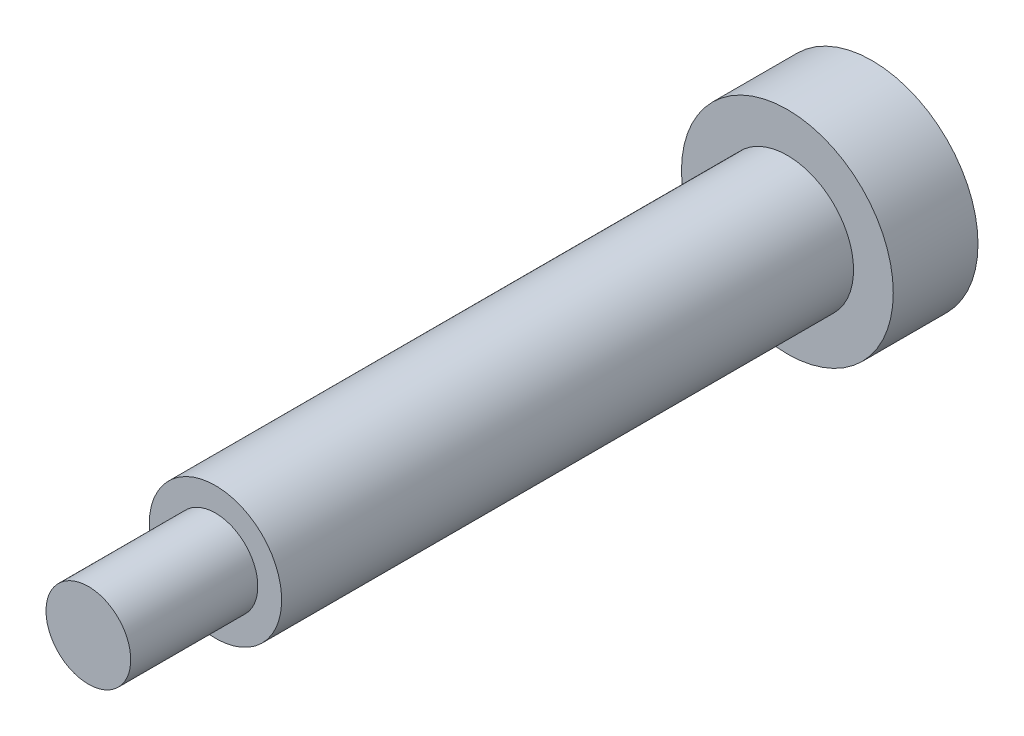
ISO-10303-21;
HEADER;
FILE_DESCRIPTION(('STEP AP214'),'2;1');
FILE_NAME('part.step','',(''),(''),'','','');
FILE_SCHEMA(('AUTOMOTIVE_DESIGN { 1 0 10303 214 1 1 1 1 }'));
ENDSEC;
DATA;
#1=APPLICATION_CONTEXT('core data for automotive mechanical design processes');
#2=APPLICATION_PROTOCOL_DEFINITION('international standard','automotive_design',2000,#1);
#3=PRODUCT_CONTEXT('',#1,'mechanical');
#4=PRODUCT('Part','Part','',(#3));
#5=PRODUCT_RELATED_PRODUCT_CATEGORY('part','',(#4));
#6=PRODUCT_DEFINITION_FORMATION('','',#4);
#7=PRODUCT_DEFINITION_CONTEXT('part definition',#1,'design');
#8=PRODUCT_DEFINITION('design','',#6,#7);
#9=PRODUCT_DEFINITION_SHAPE('','',#8);
#10=(LENGTH_UNIT() NAMED_UNIT(*) SI_UNIT(.MILLI.,.METRE.));
#11=(NAMED_UNIT(*) PLANE_ANGLE_UNIT() SI_UNIT($,.RADIAN.));
#12=(NAMED_UNIT(*) SI_UNIT($,.STERADIAN.) SOLID_ANGLE_UNIT());
#13=UNCERTAINTY_MEASURE_WITH_UNIT(LENGTH_MEASURE(1.E-05),#10,'distance_accuracy_value','');
#14=(GEOMETRIC_REPRESENTATION_CONTEXT(3) GLOBAL_UNCERTAINTY_ASSIGNED_CONTEXT((#13)) GLOBAL_UNIT_ASSIGNED_CONTEXT((#10,
#11,#12)) REPRESENTATION_CONTEXT('',''));
#15=CARTESIAN_POINT('',(0.,0.,0.));
#16=DIRECTION('',(0.,0.,1.));
#17=DIRECTION('',(1.,0.,0.));
#18=AXIS2_PLACEMENT_3D('',#15,#16,#17);
#19=CARTESIAN_POINT('',(0.,0.,0.));
#20=DIRECTION('',(0.,0.,-1.));
#21=DIRECTION('',(-1.,0.,0.));
#22=AXIS2_PLACEMENT_3D('',#19,#20,#21);
#23=PLANE('',#22);
#24=CARTESIAN_POINT('',(0.,0.,0.));
#25=DIRECTION('',(0.,0.,-1.));
#26=DIRECTION('',(-1.,0.,0.));
#27=AXIS2_PLACEMENT_3D('',#24,#25,#26);
#28=CIRCLE('',#27,2.);
#29=CARTESIAN_POINT('',(-2.,0.,0.));
#30=VERTEX_POINT('',#29);
#31=EDGE_CURVE('E10',#30,#30,#28,.T.);
#32=ORIENTED_EDGE('',*,*,#31,.F.);
#33=EDGE_LOOP('',(#32));
#34=FACE_BOUND('',#33,.T.);
#35=ADVANCED_FACE('F39',(#34),#23,.F.);
#36=CARTESIAN_POINT('',(0.,0.,-34.6363636363637));
#37=DIRECTION('',(0.,0.,-1.));
#38=DIRECTION('',(-1.,0.,0.));
#39=AXIS2_PLACEMENT_3D('',#36,#37,#38);
#40=CYLINDRICAL_SURFACE('',#39,2.);
#41=CARTESIAN_POINT('',(0.,0.,-6.));
#42=DIRECTION('',(0.,0.,-1.));
#43=DIRECTION('',(-1.,0.,0.));
#44=AXIS2_PLACEMENT_3D('',#41,#42,#43);
#45=CIRCLE('',#44,2.);
#46=CARTESIAN_POINT('',(-2.,0.,-6.));
#47=VERTEX_POINT('',#46);
#48=EDGE_CURVE('E45',#47,#47,#45,.T.);
#49=ORIENTED_EDGE('',*,*,#48,.F.);
#50=EDGE_LOOP('',(#49));
#51=FACE_BOUND('',#50,.T.);
#52=ORIENTED_EDGE('',*,*,#31,.T.);
#53=EDGE_LOOP('',(#52));
#54=FACE_BOUND('',#53,.T.);
#55=ADVANCED_FACE('F87',(#51,#54),#40,.T.);
#56=CARTESIAN_POINT('',(2.,0.,-6.));
#57=DIRECTION('',(0.,0.,-1.));
#58=DIRECTION('',(-1.,0.,0.));
#59=AXIS2_PLACEMENT_3D('',#56,#57,#58);
#60=PLANE('',#59);
#61=CARTESIAN_POINT('',(0.,0.,-6.));
#62=DIRECTION('',(0.,0.,-1.));
#63=DIRECTION('',(-1.,0.,0.));
#64=AXIS2_PLACEMENT_3D('',#61,#62,#63);
#65=CIRCLE('',#64,3.125);
#66=CARTESIAN_POINT('',(-3.125,0.,-6.));
#67=VERTEX_POINT('',#66);
#68=EDGE_CURVE('E49',#67,#67,#65,.T.);
#69=ORIENTED_EDGE('',*,*,#68,.F.);
#70=EDGE_LOOP('',(#69));
#71=FACE_BOUND('',#70,.T.);
#72=ORIENTED_EDGE('',*,*,#48,.T.);
#73=EDGE_LOOP('',(#72));
#74=FACE_BOUND('',#73,.T.);
#75=ADVANCED_FACE('F82',(#71,#74),#60,.F.);
#76=CARTESIAN_POINT('',(0.,0.,-34.6363636363637));
#77=DIRECTION('',(0.,0.,-1.));
#78=DIRECTION('',(-1.,0.,0.));
#79=AXIS2_PLACEMENT_3D('',#76,#77,#78);
#80=CYLINDRICAL_SURFACE('',#79,3.125);
#81=CARTESIAN_POINT('',(0.,0.,-33.));
#82=DIRECTION('',(0.,0.,-1.));
#83=DIRECTION('',(-1.,0.,0.));
#84=AXIS2_PLACEMENT_3D('',#81,#82,#83);
#85=CIRCLE('',#84,3.125);
#86=CARTESIAN_POINT('',(-3.125,0.,-33.));
#87=VERTEX_POINT('',#86);
#88=EDGE_CURVE('E53',#87,#87,#85,.T.);
#89=ORIENTED_EDGE('',*,*,#88,.F.);
#90=EDGE_LOOP('',(#89));
#91=FACE_BOUND('',#90,.T.);
#92=ORIENTED_EDGE('',*,*,#68,.T.);
#93=EDGE_LOOP('',(#92));
#94=FACE_BOUND('',#93,.T.);
#95=ADVANCED_FACE('F76',(#91,#94),#80,.T.);
#96=CARTESIAN_POINT('',(3.125,0.,-33.));
#97=DIRECTION('',(0.,0.,-1.));
#98=DIRECTION('',(-1.,0.,0.));
#99=AXIS2_PLACEMENT_3D('',#96,#97,#98);
#100=PLANE('',#99);
#101=CARTESIAN_POINT('',(0.,0.,-33.));
#102=DIRECTION('',(0.,0.,-1.));
#103=DIRECTION('',(-1.,0.,0.));
#104=AXIS2_PLACEMENT_3D('',#101,#102,#103);
#105=CIRCLE('',#104,5.);
#106=CARTESIAN_POINT('',(-5.,0.,-33.));
#107=VERTEX_POINT('',#106);
#108=EDGE_CURVE('E58',#107,#107,#105,.T.);
#109=ORIENTED_EDGE('',*,*,#108,.F.);
#110=EDGE_LOOP('',(#109));
#111=FACE_BOUND('',#110,.T.);
#112=ORIENTED_EDGE('',*,*,#88,.T.);
#113=EDGE_LOOP('',(#112));
#114=FACE_BOUND('',#113,.T.);
#115=ADVANCED_FACE('F70',(#111,#114),#100,.F.);
#116=CARTESIAN_POINT('',(0.,0.,-34.6363636363637));
#117=DIRECTION('',(0.,0.,-1.));
#118=DIRECTION('',(-1.,0.,0.));
#119=AXIS2_PLACEMENT_3D('',#116,#117,#118);
#120=CYLINDRICAL_SURFACE('',#119,5.);
#121=CARTESIAN_POINT('',(0.,0.,-37.));
#122=DIRECTION('',(0.,0.,-1.));
#123=DIRECTION('',(-1.,0.,0.));
#124=AXIS2_PLACEMENT_3D('',#121,#122,#123);
#125=CIRCLE('',#124,5.);
#126=CARTESIAN_POINT('',(-5.,0.,-37.));
#127=VERTEX_POINT('',#126);
#128=EDGE_CURVE('E61',#127,#127,#125,.T.);
#129=ORIENTED_EDGE('',*,*,#128,.F.);
#130=EDGE_LOOP('',(#129));
#131=FACE_BOUND('',#130,.T.);
#132=ORIENTED_EDGE('',*,*,#108,.T.);
#133=EDGE_LOOP('',(#132));
#134=FACE_BOUND('',#133,.T.);
#135=ADVANCED_FACE('F67',(#131,#134),#120,.T.);
#136=CARTESIAN_POINT('',(5.,0.,-37.));
#137=DIRECTION('',(0.,0.,1.));
#138=DIRECTION('',(1.,0.,0.));
#139=AXIS2_PLACEMENT_3D('',#136,#137,#138);
#140=PLANE('',#139);
#141=ORIENTED_EDGE('',*,*,#128,.T.);
#142=EDGE_LOOP('',(#141));
#143=FACE_BOUND('',#142,.T.);
#144=ADVANCED_FACE('F65',(#143),#140,.F.);
#145=CLOSED_SHELL('',(#35,#55,#75,#95,#115,#135,#144));
#146=MANIFOLD_SOLID_BREP('B2',#145);
#147=ADVANCED_BREP_SHAPE_REPRESENTATION('',(#18,#146),#14);
#148=SHAPE_DEFINITION_REPRESENTATION(#9,#147);
ENDSEC;
END-ISO-10303-21;
